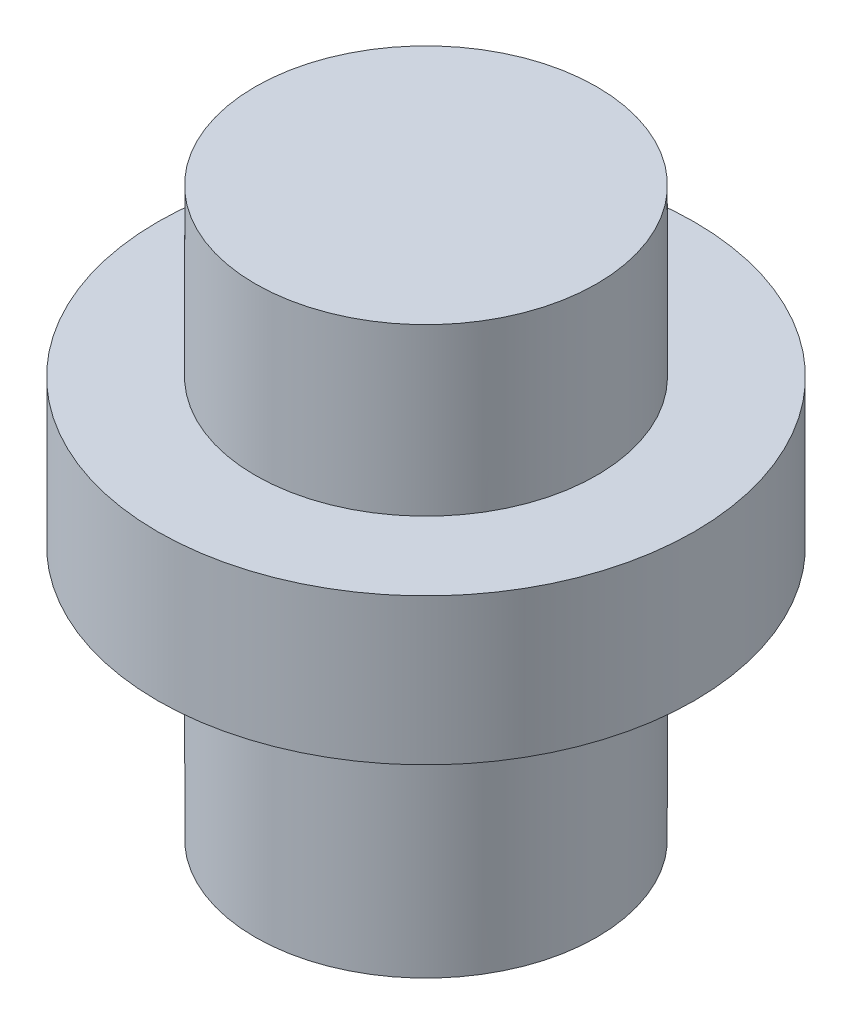
ISO-10303-21;
HEADER;
FILE_DESCRIPTION(('STEP AP214'),'2;1');
FILE_NAME('part.step','',(''),(''),'','','');
FILE_SCHEMA(('AUTOMOTIVE_DESIGN { 1 0 10303 214 1 1 1 1 }'));
ENDSEC;
DATA;
#1=APPLICATION_CONTEXT('core data for automotive mechanical design processes');
#2=APPLICATION_PROTOCOL_DEFINITION('international standard','automotive_design',2000,#1);
#3=PRODUCT_CONTEXT('',#1,'mechanical');
#4=PRODUCT('Part','Part','',(#3));
#5=PRODUCT_RELATED_PRODUCT_CATEGORY('part','',(#4));
#6=PRODUCT_DEFINITION_FORMATION('','',#4);
#7=PRODUCT_DEFINITION_CONTEXT('part definition',#1,'design');
#8=PRODUCT_DEFINITION('design','',#6,#7);
#9=PRODUCT_DEFINITION_SHAPE('','',#8);
#10=(LENGTH_UNIT() NAMED_UNIT(*) SI_UNIT(.MILLI.,.METRE.));
#11=(NAMED_UNIT(*) PLANE_ANGLE_UNIT() SI_UNIT($,.RADIAN.));
#12=(NAMED_UNIT(*) SI_UNIT($,.STERADIAN.) SOLID_ANGLE_UNIT());
#13=UNCERTAINTY_MEASURE_WITH_UNIT(LENGTH_MEASURE(1.E-05),#10,'distance_accuracy_value','');
#14=(GEOMETRIC_REPRESENTATION_CONTEXT(3) GLOBAL_UNCERTAINTY_ASSIGNED_CONTEXT((#13)) GLOBAL_UNIT_ASSIGNED_CONTEXT((#10,
#11,#12)) REPRESENTATION_CONTEXT('',''));
#15=CARTESIAN_POINT('',(0.,0.,0.));
#16=DIRECTION('',(0.,0.,1.));
#17=DIRECTION('',(1.,0.,0.));
#18=AXIS2_PLACEMENT_3D('',#15,#16,#17);
#19=CARTESIAN_POINT('',(13.6355146671841,-14.35,-19.6205793603908));
#20=DIRECTION('',(0.,1.,0.));
#21=DIRECTION('',(0.,0.,1.));
#22=AXIS2_PLACEMENT_3D('',#19,#20,#21);
#23=CYLINDRICAL_SURFACE('',#22,1.75);
#24=CARTESIAN_POINT('',(13.6355146671841,-14.35,-19.6205793603908));
#25=DIRECTION('',(0.,-1.,0.));
#26=DIRECTION('',(0.,0.,-1.));
#27=AXIS2_PLACEMENT_3D('',#24,#25,#26);
#28=CIRCLE('',#27,1.75);
#29=CARTESIAN_POINT('',(13.6355146671841,-14.35,-21.3705793603908));
#30=VERTEX_POINT('',#29);
#31=EDGE_CURVE('E60',#30,#30,#28,.T.);
#32=ORIENTED_EDGE('',*,*,#31,.F.);
#33=EDGE_LOOP('',(#32));
#34=FACE_BOUND('',#33,.T.);
#35=CARTESIAN_POINT('',(13.6355146671841,-11.75,-19.6205793603908));
#36=DIRECTION('',(0.,1.,0.));
#37=DIRECTION('',(0.,0.,1.));
#38=AXIS2_PLACEMENT_3D('',#35,#36,#37);
#39=CIRCLE('',#38,1.75);
#40=CARTESIAN_POINT('',(13.6355146671841,-11.75,-17.8705793603908));
#41=VERTEX_POINT('',#40);
#42=EDGE_CURVE('E11',#41,#41,#39,.T.);
#43=ORIENTED_EDGE('',*,*,#42,.F.);
#44=EDGE_LOOP('',(#43));
#45=FACE_BOUND('',#44,.T.);
#46=ADVANCED_FACE('F47',(#34,#45),#23,.T.);
#47=CARTESIAN_POINT('',(13.6355146671841,-14.35,-19.6205793603908));
#48=DIRECTION('',(0.,-1.,0.));
#49=DIRECTION('',(0.,0.,-1.));
#50=AXIS2_PLACEMENT_3D('',#47,#48,#49);
#51=PLANE('',#50);
#52=ORIENTED_EDGE('',*,*,#31,.T.);
#53=EDGE_LOOP('',(#52));
#54=FACE_BOUND('',#53,.T.);
#55=ADVANCED_FACE('F94',(#54),#51,.T.);
#56=CARTESIAN_POINT('',(13.6355146671841,-11.75,-19.6205793603908));
#57=DIRECTION('',(0.,1.,0.));
#58=DIRECTION('',(0.,0.,1.));
#59=AXIS2_PLACEMENT_3D('',#56,#57,#58);
#60=CYLINDRICAL_SURFACE('',#59,2.75);
#61=CARTESIAN_POINT('',(13.6355146671841,-11.75,-19.6205793603908));
#62=DIRECTION('',(0.,1.,0.));
#63=DIRECTION('',(1.,0.,0.));
#64=AXIS2_PLACEMENT_3D('',#61,#62,#63);
#65=CIRCLE('',#64,2.75);
#66=CARTESIAN_POINT('',(16.3855146671841,-11.75,-19.6205793603908));
#67=VERTEX_POINT('',#66);
#68=EDGE_CURVE('E68',#67,#67,#65,.T.);
#69=ORIENTED_EDGE('',*,*,#68,.T.);
#70=EDGE_LOOP('',(#69));
#71=FACE_BOUND('',#70,.T.);
#72=CARTESIAN_POINT('',(13.6355146671841,-10.25,-19.6205793603908));
#73=DIRECTION('',(0.,1.,0.));
#74=DIRECTION('',(1.,0.,0.));
#75=AXIS2_PLACEMENT_3D('',#72,#73,#74);
#76=CIRCLE('',#75,2.75);
#77=CARTESIAN_POINT('',(16.3855146671841,-10.25,-19.6205793603908));
#78=VERTEX_POINT('',#77);
#79=EDGE_CURVE('E75',#78,#78,#76,.T.);
#80=ORIENTED_EDGE('',*,*,#79,.F.);
#81=EDGE_LOOP('',(#80));
#82=FACE_BOUND('',#81,.T.);
#83=ADVANCED_FACE('F95',(#71,#82),#60,.T.);
#84=CARTESIAN_POINT('',(13.6355146671841,-11.75,-19.6205793603908));
#85=DIRECTION('',(0.,1.,0.));
#86=DIRECTION('',(0.,0.,1.));
#87=AXIS2_PLACEMENT_3D('',#84,#85,#86);
#88=PLANE('',#87);
#89=ORIENTED_EDGE('',*,*,#42,.T.);
#90=EDGE_LOOP('',(#89));
#91=FACE_BOUND('',#90,.T.);
#92=ORIENTED_EDGE('',*,*,#68,.F.);
#93=EDGE_LOOP('',(#92));
#94=FACE_BOUND('',#93,.T.);
#95=ADVANCED_FACE('F86',(#91,#94),#88,.F.);
#96=CARTESIAN_POINT('',(13.6355146671841,-10.25,-19.6205793603908));
#97=DIRECTION('',(0.,1.,0.));
#98=DIRECTION('',(0.,0.,1.));
#99=AXIS2_PLACEMENT_3D('',#96,#97,#98);
#100=PLANE('',#99);
#101=CARTESIAN_POINT('',(13.6355146671841,-10.25,-19.6205793603908));
#102=DIRECTION('',(0.,1.,0.));
#103=DIRECTION('',(0.,0.,1.));
#104=AXIS2_PLACEMENT_3D('',#101,#102,#103);
#105=CIRCLE('',#104,1.75);
#106=CARTESIAN_POINT('',(13.6355146671841,-10.25,-17.8705793603908));
#107=VERTEX_POINT('',#106);
#108=EDGE_CURVE('E73',#107,#107,#105,.T.);
#109=ORIENTED_EDGE('',*,*,#108,.F.);
#110=EDGE_LOOP('',(#109));
#111=FACE_BOUND('',#110,.T.);
#112=ORIENTED_EDGE('',*,*,#79,.T.);
#113=EDGE_LOOP('',(#112));
#114=FACE_BOUND('',#113,.T.);
#115=ADVANCED_FACE('F81',(#111,#114),#100,.T.);
#116=CARTESIAN_POINT('',(13.6355146671841,-8.55,-19.6205793603908));
#117=DIRECTION('',(0.,-1.,0.));
#118=DIRECTION('',(0.,0.,-1.));
#119=AXIS2_PLACEMENT_3D('',#116,#117,#118);
#120=PLANE('',#119);
#121=CARTESIAN_POINT('',(13.6355146671841,-8.55,-19.6205793603908));
#122=DIRECTION('',(0.,-1.,0.));
#123=DIRECTION('',(0.,0.,-1.));
#124=AXIS2_PLACEMENT_3D('',#121,#122,#123);
#125=CIRCLE('',#124,1.75);
#126=CARTESIAN_POINT('',(13.6355146671841,-8.55,-21.3705793603908));
#127=VERTEX_POINT('',#126);
#128=EDGE_CURVE('E65',#127,#127,#125,.T.);
#129=ORIENTED_EDGE('',*,*,#128,.F.);
#130=EDGE_LOOP('',(#129));
#131=FACE_BOUND('',#130,.T.);
#132=ADVANCED_FACE('F87',(#131),#120,.F.);
#133=ORIENTED_EDGE('',*,*,#108,.T.);
#134=EDGE_LOOP('',(#133));
#135=FACE_BOUND('',#134,.T.);
#136=ORIENTED_EDGE('',*,*,#128,.T.);
#137=EDGE_LOOP('',(#136));
#138=FACE_BOUND('',#137,.T.);
#139=ADVANCED_FACE('F51',(#135,#138),#23,.T.);
#140=CLOSED_SHELL('',(#46,#55,#83,#95,#115,#132,#139));
#141=MANIFOLD_SOLID_BREP('B2',#140);
#142=ADVANCED_BREP_SHAPE_REPRESENTATION('',(#18,#141),#14);
#143=SHAPE_DEFINITION_REPRESENTATION(#9,#142);
ENDSEC;
END-ISO-10303-21;
